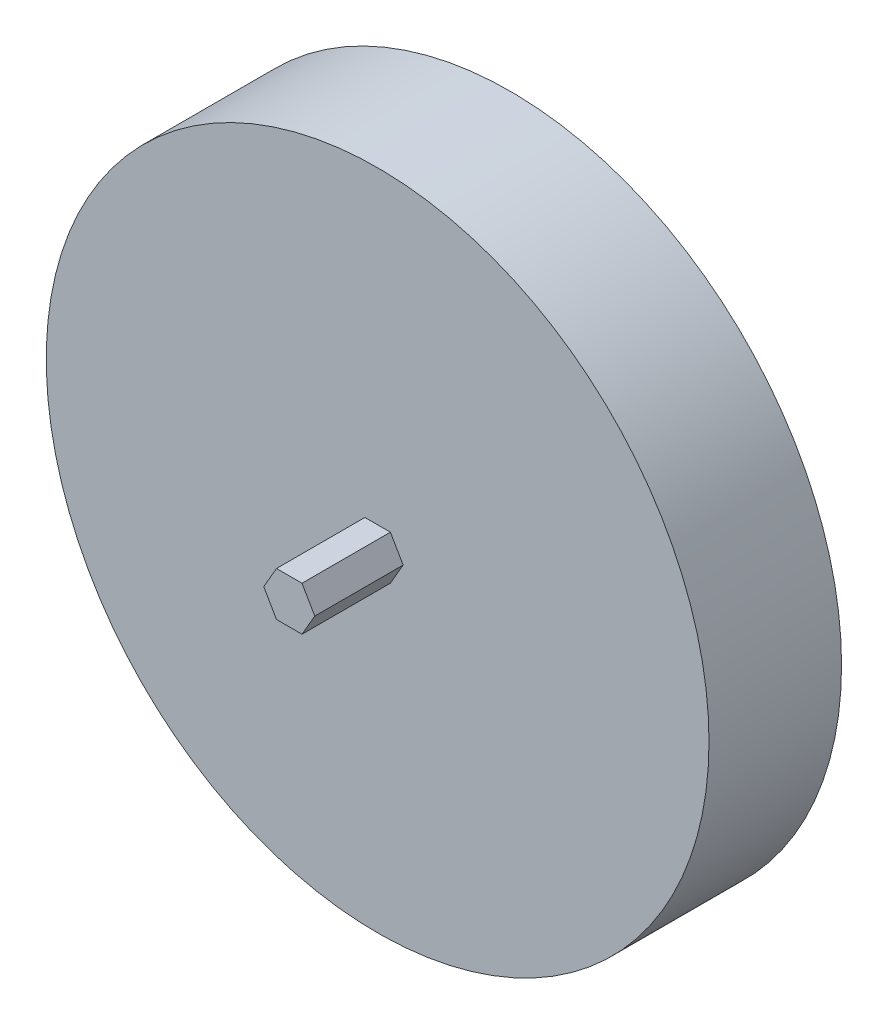
ISO-10303-21;
HEADER;
FILE_DESCRIPTION(('STEP AP214'),'2;1');
FILE_NAME('part.step','',(''),(''),'','','');
FILE_SCHEMA(('AUTOMOTIVE_DESIGN { 1 0 10303 214 1 1 1 1 }'));
ENDSEC;
DATA;
#1=APPLICATION_CONTEXT('core data for automotive mechanical design processes');
#2=APPLICATION_PROTOCOL_DEFINITION('international standard','automotive_design',2000,#1);
#3=PRODUCT_CONTEXT('',#1,'mechanical');
#4=PRODUCT('Part','Part','',(#3));
#5=PRODUCT_RELATED_PRODUCT_CATEGORY('part','',(#4));
#6=PRODUCT_DEFINITION_FORMATION('','',#4);
#7=PRODUCT_DEFINITION_CONTEXT('part definition',#1,'design');
#8=PRODUCT_DEFINITION('design','',#6,#7);
#9=PRODUCT_DEFINITION_SHAPE('','',#8);
#10=(LENGTH_UNIT() NAMED_UNIT(*) SI_UNIT(.MILLI.,.METRE.));
#11=(NAMED_UNIT(*) PLANE_ANGLE_UNIT() SI_UNIT($,.RADIAN.));
#12=(NAMED_UNIT(*) SI_UNIT($,.STERADIAN.) SOLID_ANGLE_UNIT());
#13=UNCERTAINTY_MEASURE_WITH_UNIT(LENGTH_MEASURE(1.E-05),#10,'distance_accuracy_value','');
#14=(GEOMETRIC_REPRESENTATION_CONTEXT(3) GLOBAL_UNCERTAINTY_ASSIGNED_CONTEXT((#13)) GLOBAL_UNIT_ASSIGNED_CONTEXT((#10,
#11,#12)) REPRESENTATION_CONTEXT('',''));
#15=CARTESIAN_POINT('',(0.,0.,0.));
#16=DIRECTION('',(0.,0.,1.));
#17=DIRECTION('',(1.,0.,0.));
#18=AXIS2_PLACEMENT_3D('',#15,#16,#17);
#19=CARTESIAN_POINT('',(0.,0.,6.));
#20=DIRECTION('',(0.,0.,1.));
#21=DIRECTION('',(1.,0.,0.));
#22=AXIS2_PLACEMENT_3D('',#19,#20,#21);
#23=PLANE('',#22);
#24=CARTESIAN_POINT('',(0.,0.,6.));
#25=DIRECTION('',(0.,0.,1.));
#26=DIRECTION('',(1.,0.,0.));
#27=AXIS2_PLACEMENT_3D('',#24,#25,#26);
#28=CIRCLE('',#27,15.);
#29=CARTESIAN_POINT('',(15.,0.,6.));
#30=VERTEX_POINT('',#29);
#31=EDGE_CURVE('E11',#30,#30,#28,.T.);
#32=ORIENTED_EDGE('',*,*,#31,.T.);
#33=EDGE_LOOP('',(#32));
#34=FACE_BOUND('',#33,.T.);
#35=DIRECTION('',(-0.5,0.866025403784439,0.));
#36=VECTOR('',#35,1.);
#37=CARTESIAN_POINT('',(1.15470053837925,0.,6.));
#38=LINE('',#37,#36);
#39=CARTESIAN_POINT('',(1.15470053837925,0.,6.));
#40=VERTEX_POINT('',#39);
#41=CARTESIAN_POINT('',(0.577350269189625,1.,6.));
#42=VERTEX_POINT('',#41);
#43=EDGE_CURVE('E120',#40,#42,#38,.T.);
#44=ORIENTED_EDGE('',*,*,#43,.F.);
#45=DIRECTION('',(0.5,0.866025403784439,0.));
#46=VECTOR('',#45,1.);
#47=CARTESIAN_POINT('',(0.577350269189626,-1.,6.));
#48=LINE('',#47,#46);
#49=CARTESIAN_POINT('',(0.577350269189626,-1.,6.));
#50=VERTEX_POINT('',#49);
#51=EDGE_CURVE('E117',#50,#40,#48,.T.);
#52=ORIENTED_EDGE('',*,*,#51,.F.);
#53=DIRECTION('',(1.,0.,0.));
#54=VECTOR('',#53,1.);
#55=CARTESIAN_POINT('',(-0.577350269189626,-1.,6.));
#56=LINE('',#55,#54);
#57=CARTESIAN_POINT('',(-0.577350269189626,-1.,6.));
#58=VERTEX_POINT('',#57);
#59=EDGE_CURVE('E76',#58,#50,#56,.T.);
#60=ORIENTED_EDGE('',*,*,#59,.F.);
#61=DIRECTION('',(0.5,-0.866025403784439,0.));
#62=VECTOR('',#61,1.);
#63=CARTESIAN_POINT('',(-1.15470053837925,0.,6.));
#64=LINE('',#63,#62);
#65=CARTESIAN_POINT('',(-1.15470053837925,0.,6.));
#66=VERTEX_POINT('',#65);
#67=EDGE_CURVE('E125',#66,#58,#64,.T.);
#68=ORIENTED_EDGE('',*,*,#67,.F.);
#69=DIRECTION('',(-0.5,-0.866025403784439,0.));
#70=VECTOR('',#69,1.);
#71=CARTESIAN_POINT('',(-0.577350269189626,1.,6.));
#72=LINE('',#71,#70);
#73=CARTESIAN_POINT('',(-0.577350269189626,1.,6.));
#74=VERTEX_POINT('',#73);
#75=EDGE_CURVE('E106',#74,#66,#72,.T.);
#76=ORIENTED_EDGE('',*,*,#75,.F.);
#77=DIRECTION('',(-1.,0.,0.));
#78=VECTOR('',#77,1.);
#79=CARTESIAN_POINT('',(0.577350269189625,1.,6.));
#80=LINE('',#79,#78);
#81=EDGE_CURVE('E122',#42,#74,#80,.T.);
#82=ORIENTED_EDGE('',*,*,#81,.F.);
#83=EDGE_LOOP('',(#44,#52,#60,#68,#76,#82));
#84=FACE_BOUND('',#83,.T.);
#85=ADVANCED_FACE('F33',(#34,#84),#23,.T.);
#86=CARTESIAN_POINT('',(0.,0.,6.));
#87=DIRECTION('',(0.,0.,-1.));
#88=DIRECTION('',(-1.,0.,0.));
#89=AXIS2_PLACEMENT_3D('',#86,#87,#88);
#90=CYLINDRICAL_SURFACE('',#89,15.);
#91=ORIENTED_EDGE('',*,*,#31,.F.);
#92=EDGE_LOOP('',(#91));
#93=FACE_BOUND('',#92,.T.);
#94=CARTESIAN_POINT('',(0.,0.,0.));
#95=DIRECTION('',(0.,0.,1.));
#96=DIRECTION('',(1.,0.,0.));
#97=AXIS2_PLACEMENT_3D('',#94,#95,#96);
#98=CIRCLE('',#97,15.);
#99=CARTESIAN_POINT('',(15.,0.,0.));
#100=VERTEX_POINT('',#99);
#101=EDGE_CURVE('E37',#100,#100,#98,.T.);
#102=ORIENTED_EDGE('',*,*,#101,.T.);
#103=EDGE_LOOP('',(#102));
#104=FACE_BOUND('',#103,.T.);
#105=ADVANCED_FACE('F35',(#93,#104),#90,.T.);
#106=CARTESIAN_POINT('',(0.,0.,0.));
#107=DIRECTION('',(0.,0.,1.));
#108=DIRECTION('',(1.,0.,0.));
#109=AXIS2_PLACEMENT_3D('',#106,#107,#108);
#110=PLANE('',#109);
#111=ORIENTED_EDGE('',*,*,#101,.F.);
#112=EDGE_LOOP('',(#111));
#113=FACE_BOUND('',#112,.T.);
#114=ADVANCED_FACE('F141',(#113),#110,.F.);
#115=CARTESIAN_POINT('',(0.577350269189626,-1.,10.));
#116=DIRECTION('',(-0.866025403784439,0.5,0.));
#117=DIRECTION('',(-0.5,-0.866025403784439,0.));
#118=AXIS2_PLACEMENT_3D('',#115,#116,#117);
#119=PLANE('',#118);
#120=ORIENTED_EDGE('',*,*,#51,.T.);
#121=DIRECTION('',(0.,0.,-1.));
#122=VECTOR('',#121,1.);
#123=CARTESIAN_POINT('',(1.15470053837925,0.,10.));
#124=LINE('',#123,#122);
#125=CARTESIAN_POINT('',(1.15470053837925,0.,10.));
#126=VERTEX_POINT('',#125);
#127=EDGE_CURVE('E135',#126,#40,#124,.T.);
#128=ORIENTED_EDGE('',*,*,#127,.F.);
#129=DIRECTION('',(0.5,0.866025403784439,0.));
#130=VECTOR('',#129,1.);
#131=CARTESIAN_POINT('',(0.577350269189626,-1.,10.));
#132=LINE('',#131,#130);
#133=CARTESIAN_POINT('',(0.577350269189626,-1.,10.));
#134=VERTEX_POINT('',#133);
#135=EDGE_CURVE('E128',#134,#126,#132,.T.);
#136=ORIENTED_EDGE('',*,*,#135,.F.);
#137=DIRECTION('',(0.,0.,-1.));
#138=VECTOR('',#137,1.);
#139=CARTESIAN_POINT('',(0.577350269189626,-1.,10.));
#140=LINE('',#139,#138);
#141=EDGE_CURVE('E113',#134,#50,#140,.T.);
#142=ORIENTED_EDGE('',*,*,#141,.T.);
#143=EDGE_LOOP('',(#120,#128,#136,#142));
#144=FACE_BOUND('',#143,.T.);
#145=ADVANCED_FACE('F143',(#144),#119,.F.);
#146=CARTESIAN_POINT('',(1.15470053837925,0.,10.));
#147=DIRECTION('',(-0.866025403784439,-0.5,0.));
#148=DIRECTION('',(0.5,-0.866025403784439,0.));
#149=AXIS2_PLACEMENT_3D('',#146,#147,#148);
#150=PLANE('',#149);
#151=ORIENTED_EDGE('',*,*,#43,.T.);
#152=DIRECTION('',(0.,0.,-1.));
#153=VECTOR('',#152,1.);
#154=CARTESIAN_POINT('',(0.577350269189625,1.,10.));
#155=LINE('',#154,#153);
#156=CARTESIAN_POINT('',(0.577350269189625,1.,10.));
#157=VERTEX_POINT('',#156);
#158=EDGE_CURVE('E132',#157,#42,#155,.T.);
#159=ORIENTED_EDGE('',*,*,#158,.F.);
#160=DIRECTION('',(-0.5,0.866025403784439,0.));
#161=VECTOR('',#160,1.);
#162=CARTESIAN_POINT('',(1.15470053837925,0.,10.));
#163=LINE('',#162,#161);
#164=EDGE_CURVE('E84',#126,#157,#163,.T.);
#165=ORIENTED_EDGE('',*,*,#164,.F.);
#166=ORIENTED_EDGE('',*,*,#127,.T.);
#167=EDGE_LOOP('',(#151,#159,#165,#166));
#168=FACE_BOUND('',#167,.T.);
#169=ADVANCED_FACE('F148',(#168),#150,.F.);
#170=CARTESIAN_POINT('',(0.577350269189625,1.,10.));
#171=DIRECTION('',(0.,-1.,0.));
#172=DIRECTION('',(1.,0.,0.));
#173=AXIS2_PLACEMENT_3D('',#170,#171,#172);
#174=PLANE('',#173);
#175=ORIENTED_EDGE('',*,*,#81,.T.);
#176=DIRECTION('',(0.,0.,-1.));
#177=VECTOR('',#176,1.);
#178=CARTESIAN_POINT('',(-0.577350269189626,1.,10.));
#179=LINE('',#178,#177);
#180=CARTESIAN_POINT('',(-0.577350269189626,1.,10.));
#181=VERTEX_POINT('',#180);
#182=EDGE_CURVE('E109',#181,#74,#179,.T.);
#183=ORIENTED_EDGE('',*,*,#182,.F.);
#184=DIRECTION('',(-1.,0.,0.));
#185=VECTOR('',#184,1.);
#186=CARTESIAN_POINT('',(0.577350269189625,1.,10.));
#187=LINE('',#186,#185);
#188=EDGE_CURVE('E97',#157,#181,#187,.T.);
#189=ORIENTED_EDGE('',*,*,#188,.F.);
#190=ORIENTED_EDGE('',*,*,#158,.T.);
#191=EDGE_LOOP('',(#175,#183,#189,#190));
#192=FACE_BOUND('',#191,.T.);
#193=ADVANCED_FACE('F161',(#192),#174,.F.);
#194=CARTESIAN_POINT('',(-0.577350269189626,1.,10.));
#195=DIRECTION('',(0.866025403784439,-0.5,0.));
#196=DIRECTION('',(0.5,0.866025403784439,0.));
#197=AXIS2_PLACEMENT_3D('',#194,#195,#196);
#198=PLANE('',#197);
#199=ORIENTED_EDGE('',*,*,#75,.T.);
#200=DIRECTION('',(0.,0.,-1.));
#201=VECTOR('',#200,1.);
#202=CARTESIAN_POINT('',(-1.15470053837925,0.,10.));
#203=LINE('',#202,#201);
#204=CARTESIAN_POINT('',(-1.15470053837925,0.,10.));
#205=VERTEX_POINT('',#204);
#206=EDGE_CURVE('E103',#205,#66,#203,.T.);
#207=ORIENTED_EDGE('',*,*,#206,.F.);
#208=DIRECTION('',(-0.5,-0.866025403784439,0.));
#209=VECTOR('',#208,1.);
#210=CARTESIAN_POINT('',(-0.577350269189626,1.,10.));
#211=LINE('',#210,#209);
#212=EDGE_CURVE('E91',#181,#205,#211,.T.);
#213=ORIENTED_EDGE('',*,*,#212,.F.);
#214=ORIENTED_EDGE('',*,*,#182,.T.);
#215=EDGE_LOOP('',(#199,#207,#213,#214));
#216=FACE_BOUND('',#215,.T.);
#217=ADVANCED_FACE('F104',(#216),#198,.F.);
#218=CARTESIAN_POINT('',(-1.15470053837925,0.,10.));
#219=DIRECTION('',(0.866025403784439,0.5,0.));
#220=DIRECTION('',(-0.5,0.866025403784439,0.));
#221=AXIS2_PLACEMENT_3D('',#218,#219,#220);
#222=PLANE('',#221);
#223=ORIENTED_EDGE('',*,*,#67,.T.);
#224=DIRECTION('',(0.,0.,-1.));
#225=VECTOR('',#224,1.);
#226=CARTESIAN_POINT('',(-0.577350269189626,-1.,10.));
#227=LINE('',#226,#225);
#228=CARTESIAN_POINT('',(-0.577350269189626,-1.,10.));
#229=VERTEX_POINT('',#228);
#230=EDGE_CURVE('E48',#229,#58,#227,.T.);
#231=ORIENTED_EDGE('',*,*,#230,.F.);
#232=DIRECTION('',(0.5,-0.866025403784439,0.));
#233=VECTOR('',#232,1.);
#234=CARTESIAN_POINT('',(-1.15470053837925,0.,10.));
#235=LINE('',#234,#233);
#236=EDGE_CURVE('E95',#205,#229,#235,.T.);
#237=ORIENTED_EDGE('',*,*,#236,.F.);
#238=ORIENTED_EDGE('',*,*,#206,.T.);
#239=EDGE_LOOP('',(#223,#231,#237,#238));
#240=FACE_BOUND('',#239,.T.);
#241=ADVANCED_FACE('F111',(#240),#222,.F.);
#242=CARTESIAN_POINT('',(-0.577350269189626,-1.,10.));
#243=DIRECTION('',(0.,1.,0.));
#244=DIRECTION('',(0.,0.,1.));
#245=AXIS2_PLACEMENT_3D('',#242,#243,#244);
#246=PLANE('',#245);
#247=ORIENTED_EDGE('',*,*,#59,.T.);
#248=ORIENTED_EDGE('',*,*,#141,.F.);
#249=DIRECTION('',(1.,0.,0.));
#250=VECTOR('',#249,1.);
#251=CARTESIAN_POINT('',(-0.577350269189626,-1.,10.));
#252=LINE('',#251,#250);
#253=EDGE_CURVE('E56',#229,#134,#252,.T.);
#254=ORIENTED_EDGE('',*,*,#253,.F.);
#255=ORIENTED_EDGE('',*,*,#230,.T.);
#256=EDGE_LOOP('',(#247,#248,#254,#255));
#257=FACE_BOUND('',#256,.T.);
#258=ADVANCED_FACE('F169',(#257),#246,.F.);
#259=CARTESIAN_POINT('',(0.,0.,10.));
#260=DIRECTION('',(0.,0.,1.));
#261=DIRECTION('',(1.,0.,0.));
#262=AXIS2_PLACEMENT_3D('',#259,#260,#261);
#263=PLANE('',#262);
#264=ORIENTED_EDGE('',*,*,#135,.T.);
#265=ORIENTED_EDGE('',*,*,#164,.T.);
#266=ORIENTED_EDGE('',*,*,#188,.T.);
#267=ORIENTED_EDGE('',*,*,#212,.T.);
#268=ORIENTED_EDGE('',*,*,#236,.T.);
#269=ORIENTED_EDGE('',*,*,#253,.T.);
#270=EDGE_LOOP('',(#264,#265,#266,#267,#268,#269));
#271=FACE_BOUND('',#270,.T.);
#272=ADVANCED_FACE('F93',(#271),#263,.T.);
#273=CLOSED_SHELL('',(#85,#105,#114,#145,#169,#193,#217,#241,#258,#272));
#274=MANIFOLD_SOLID_BREP('B2',#273);
#275=ADVANCED_BREP_SHAPE_REPRESENTATION('',(#18,#274),#14);
#276=SHAPE_DEFINITION_REPRESENTATION(#9,#275);
ENDSEC;
END-ISO-10303-21;
